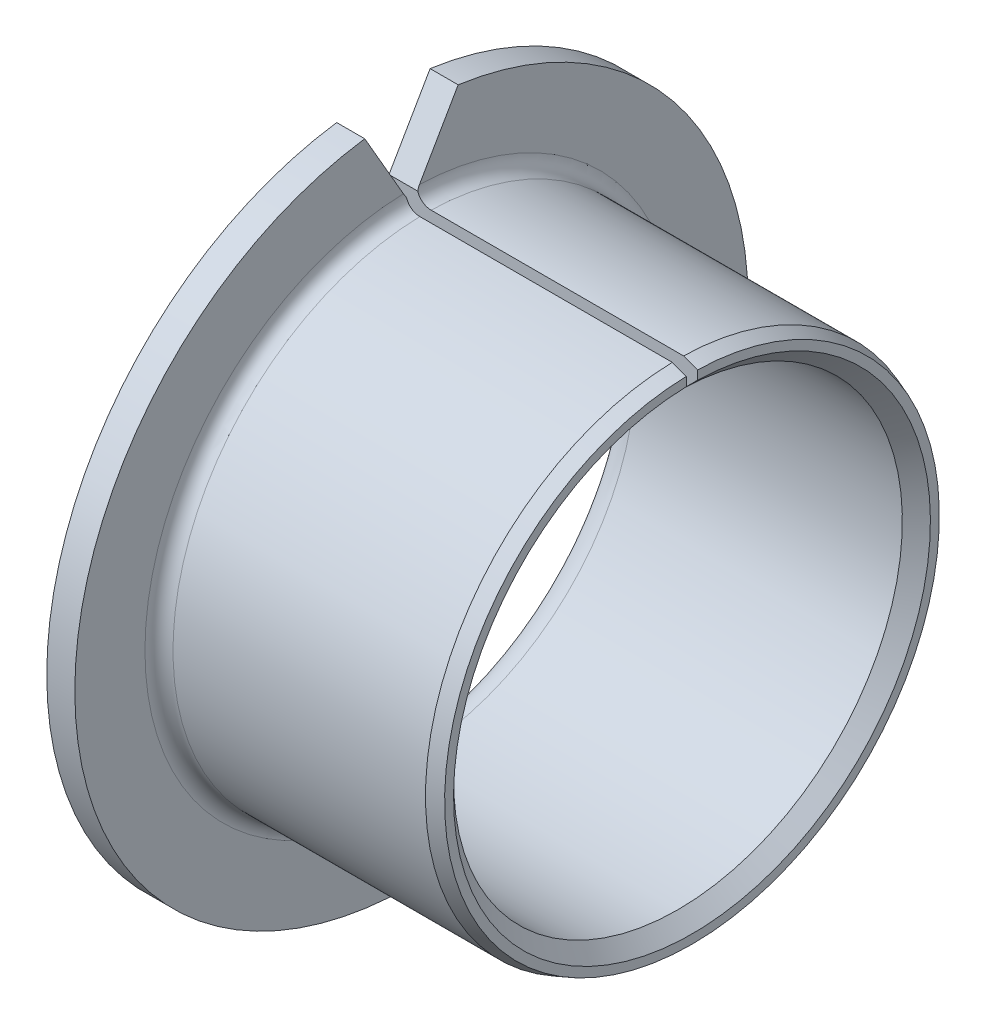
ISO-10303-21;
HEADER;
FILE_DESCRIPTION(('STEP AP214'),'2;1');
FILE_NAME('part.step','',(''),(''),'','','');
FILE_SCHEMA(('AUTOMOTIVE_DESIGN { 1 0 10303 214 1 1 1 1 }'));
ENDSEC;
DATA;
#1=APPLICATION_CONTEXT('core data for automotive mechanical design processes');
#2=APPLICATION_PROTOCOL_DEFINITION('international standard','automotive_design',2000,#1);
#3=PRODUCT_CONTEXT('',#1,'mechanical');
#4=PRODUCT('Part','Part','',(#3));
#5=PRODUCT_RELATED_PRODUCT_CATEGORY('part','',(#4));
#6=PRODUCT_DEFINITION_FORMATION('','',#4);
#7=PRODUCT_DEFINITION_CONTEXT('part definition',#1,'design');
#8=PRODUCT_DEFINITION('design','',#6,#7);
#9=PRODUCT_DEFINITION_SHAPE('','',#8);
#10=(LENGTH_UNIT() NAMED_UNIT(*) SI_UNIT(.MILLI.,.METRE.));
#11=(NAMED_UNIT(*) PLANE_ANGLE_UNIT() SI_UNIT($,.RADIAN.));
#12=(NAMED_UNIT(*) SI_UNIT($,.STERADIAN.) SOLID_ANGLE_UNIT());
#13=UNCERTAINTY_MEASURE_WITH_UNIT(LENGTH_MEASURE(1.E-05),#10,'distance_accuracy_value','');
#14=(GEOMETRIC_REPRESENTATION_CONTEXT(3) GLOBAL_UNCERTAINTY_ASSIGNED_CONTEXT((#13)) GLOBAL_UNIT_ASSIGNED_CONTEXT((#10,
#11,#12)) REPRESENTATION_CONTEXT('',''));
#15=CARTESIAN_POINT('',(0.,0.,0.));
#16=DIRECTION('',(0.,0.,1.));
#17=DIRECTION('',(1.,0.,0.));
#18=AXIS2_PLACEMENT_3D('',#15,#16,#17);
#19=CARTESIAN_POINT('',(0.,12.,0.));
#20=DIRECTION('',(-1.,0.,0.));
#21=DIRECTION('',(0.,0.,1.));
#22=AXIS2_PLACEMENT_3D('',#19,#20,#21);
#23=PLANE('',#22);
#24=DIRECTION('',(0.,0.866025403784439,-0.5));
#25=VECTOR('',#24,1.);
#26=CARTESIAN_POINT('',(0.,12.3495049383621,-1.93383757781533));
#27=LINE('',#26,#25);
#28=CARTESIAN_POINT('',(0.,9.34641016151379,-0.2));
#29=VERTEX_POINT('',#28);
#30=CARTESIAN_POINT('',(0.,11.8839244339988,-1.66503454829176));
#31=VERTEX_POINT('',#30);
#32=EDGE_CURVE('E101',#29,#31,#27,.T.);
#33=ORIENTED_EDGE('',*,*,#32,.T.);
#34=CARTESIAN_POINT('',(0.,0.,0.));
#35=DIRECTION('',(-1.,0.,0.));
#36=DIRECTION('',(0.,0.,1.));
#37=AXIS2_PLACEMENT_3D('',#34,#35,#36);
#38=CIRCLE('',#37,12.);
#39=CARTESIAN_POINT('',(0.,11.8839244339988,1.66503454829178));
#40=VERTEX_POINT('',#39);
#41=EDGE_CURVE('E196',#40,#31,#38,.F.);
#42=ORIENTED_EDGE('',*,*,#41,.F.);
#43=DIRECTION('',(0.,-0.866025403784439,-0.5));
#44=VECTOR('',#43,1.);
#45=CARTESIAN_POINT('',(0.,9.34641016151378,0.2));
#46=LINE('',#45,#44);
#47=CARTESIAN_POINT('',(0.,9.34641016151378,0.2));
#48=VERTEX_POINT('',#47);
#49=EDGE_CURVE('E121',#40,#48,#46,.T.);
#50=ORIENTED_EDGE('',*,*,#49,.T.);
#51=DIRECTION('',(0.,1.,0.));
#52=VECTOR('',#51,1.);
#53=CARTESIAN_POINT('',(0.,12.,0.2));
#54=LINE('',#53,#52);
#55=CARTESIAN_POINT('',(3.93835701897882E-10,8.9978219069115,0.199999999745788));
#56=VERTEX_POINT('',#55);
#57=EDGE_CURVE('E122',#48,#56,#54,.F.);
#58=ORIENTED_EDGE('',*,*,#57,.T.);
#59=CARTESIAN_POINT('',(9.83320196101811E-10,0.,0.));
#60=DIRECTION('',(-1.,0.,0.));
#61=DIRECTION('',(0.,0.999753058362945,-0.0222221127244391));
#62=AXIS2_PLACEMENT_3D('',#59,#60,#61);
#63=CIRCLE('',#62,9.00004434682071);
#64=CARTESIAN_POINT('',(5.89992291133434E-10,8.99782186113614,-0.2));
#65=VERTEX_POINT('',#64);
#66=EDGE_CURVE('E126',#65,#56,#63,.T.);
#67=ORIENTED_EDGE('',*,*,#66,.F.);
#68=DIRECTION('',(0.,1.,0.));
#69=VECTOR('',#68,1.);
#70=CARTESIAN_POINT('',(0.,12.,-0.200000000000001));
#71=LINE('',#70,#69);
#72=EDGE_CURVE('E113',#65,#29,#71,.T.);
#73=ORIENTED_EDGE('',*,*,#72,.T.);
#74=EDGE_LOOP('',(#33,#42,#50,#58,#67,#73));
#75=FACE_BOUND('',#74,.T.);
#76=ADVANCED_FACE('F17',(#75),#23,.T.);
#77=CARTESIAN_POINT('',(11.,9.34641016151378,0.2));
#78=DIRECTION('',(0.,-0.5,0.866025403784439));
#79=DIRECTION('',(0.,-0.866025403784439,-0.5));
#80=AXIS2_PLACEMENT_3D('',#77,#78,#79);
#81=PLANE('',#80);
#82=DIRECTION('',(0.,0.866025403784433,0.50000000000001));
#83=VECTOR('',#82,1.);
#84=CARTESIAN_POINT('',(1.,9.49568837309472,0.286185815640402));
#85=LINE('',#84,#83);
#86=CARTESIAN_POINT('',(1.,9.49568837309472,0.286185815640402));
#87=VERTEX_POINT('',#86);
#88=CARTESIAN_POINT('',(1.,11.8839244339988,1.6650345482918));
#89=VERTEX_POINT('',#88);
#90=EDGE_CURVE('E380',#87,#89,#85,.T.);
#91=ORIENTED_EDGE('',*,*,#90,.F.);
#92=CARTESIAN_POINT('',(1.02348889883189,9.34641016151753,0.200000000002162));
#93=CARTESIAN_POINT('',(1.01567070419771,9.37082921657609,0.214098348013579));
#94=CARTESIAN_POINT('',(1.00980419864463,9.39547859507013,0.228329673322472));
#95=CARTESIAN_POINT('',(1.00197456570067,9.44523799892917,0.257058278535206));
#96=CARTESIAN_POINT('',(1.00001143830979,9.47034802429418,0.271555558439047));
#97=CARTESIAN_POINT('',(1.,9.49568837309466,0.286185815640364));
#98=B_SPLINE_CURVE_WITH_KNOTS('',3,(#92,#93,#94,#95,#96,#97),.UNSPECIFIED.,.F.,.F.,(4,2,4),(0.,
0.0871828269118924,0.174365653823783),.UNSPECIFIED.);
#99=CARTESIAN_POINT('',(1.02348889883183,9.34641016151771,0.200000000001133));
#100=VERTEX_POINT('',#99);
#101=EDGE_CURVE('E197',#100,#87,#98,.T.);
#102=ORIENTED_EDGE('',*,*,#101,.F.);
#103=DIRECTION('',(1.,0.,0.));
#104=VECTOR('',#103,1.);
#105=CARTESIAN_POINT('',(11.,9.34641016151378,0.2));
#106=LINE('',#105,#104);
#107=EDGE_CURVE('E198',#48,#100,#106,.T.);
#108=ORIENTED_EDGE('',*,*,#107,.F.);
#109=ORIENTED_EDGE('',*,*,#49,.F.);
#110=DIRECTION('',(-1.,0.,0.));
#111=VECTOR('',#110,1.);
#112=CARTESIAN_POINT('',(11.,11.8839244339988,1.66503454829179));
#113=LINE('',#112,#111);
#114=EDGE_CURVE('E192',#89,#40,#113,.T.);
#115=ORIENTED_EDGE('',*,*,#114,.F.);
#116=EDGE_LOOP('',(#91,#102,#108,#109,#115));
#117=FACE_BOUND('',#116,.T.);
#118=ADVANCED_FACE('F411',(#117),#81,.F.);
#119=CARTESIAN_POINT('',(11.,0.,0.));
#120=DIRECTION('',(-1.,0.,0.));
#121=DIRECTION('',(0.,0.,1.));
#122=AXIS2_PLACEMENT_3D('',#119,#120,#121);
#123=CYLINDRICAL_SURFACE('',#122,12.);
#124=DIRECTION('',(1.,0.,0.));
#125=VECTOR('',#124,1.);
#126=CARTESIAN_POINT('',(11.,11.8839244339988,-1.66503454829175));
#127=LINE('',#126,#125);
#128=CARTESIAN_POINT('',(1.,11.8839244339988,-1.66503454829177));
#129=VERTEX_POINT('',#128);
#130=EDGE_CURVE('E147',#31,#129,#127,.T.);
#131=ORIENTED_EDGE('',*,*,#130,.T.);
#132=CARTESIAN_POINT('',(1.,0.,0.));
#133=DIRECTION('',(-1.,0.,0.));
#134=DIRECTION('',(0.,0.,1.));
#135=AXIS2_PLACEMENT_3D('',#132,#133,#134);
#136=CIRCLE('',#135,12.);
#137=EDGE_CURVE('E377',#89,#129,#136,.F.);
#138=ORIENTED_EDGE('',*,*,#137,.F.);
#139=ORIENTED_EDGE('',*,*,#114,.T.);
#140=ORIENTED_EDGE('',*,*,#41,.T.);
#141=EDGE_LOOP('',(#131,#138,#139,#140));
#142=FACE_BOUND('',#141,.T.);
#143=ADVANCED_FACE('F413',(#142),#123,.T.);
#144=CARTESIAN_POINT('',(11.,12.3495049383621,-1.93383757781533));
#145=DIRECTION('',(0.,-0.5,-0.866025403784439));
#146=DIRECTION('',(0.,0.866025403784439,-0.5));
#147=AXIS2_PLACEMENT_3D('',#144,#145,#146);
#148=PLANE('',#147);
#149=ORIENTED_EDGE('',*,*,#32,.F.);
#150=DIRECTION('',(1.,0.,0.));
#151=VECTOR('',#150,1.);
#152=CARTESIAN_POINT('',(11.,9.34641016151379,-0.199999999999999));
#153=LINE('',#152,#151);
#154=CARTESIAN_POINT('',(1.02348889883235,9.34641016151609,-0.200000000000581));
#155=VERTEX_POINT('',#154);
#156=EDGE_CURVE('E109',#155,#29,#153,.F.);
#157=ORIENTED_EDGE('',*,*,#156,.F.);
#158=CARTESIAN_POINT('',(1.,9.49568837309472,-0.286185815640397));
#159=CARTESIAN_POINT('',(1.00001143830979,9.47034802429397,-0.271555558438963));
#160=CARTESIAN_POINT('',(1.00197456570071,9.44523799892873,-0.257058278534979));
#161=CARTESIAN_POINT('',(1.00980419864481,9.39547859506924,-0.228329673321914));
#162=CARTESIAN_POINT('',(1.01567070419799,9.370829216575,-0.214098348012832));
#163=CARTESIAN_POINT('',(1.02348889883229,9.34641016151626,-0.200000000001201));
#164=B_SPLINE_CURVE_WITH_KNOTS('',3,(#158,#159,#160,#161,#162,#163),.UNSPECIFIED.,.F.,.F.,(4,2,
4),(0.,0.0871828269127378,0.174365653825477),.UNSPECIFIED.);
#165=CARTESIAN_POINT('',(1.,9.49568837309472,-0.286185815640397));
#166=VERTEX_POINT('',#165);
#167=EDGE_CURVE('E187',#166,#155,#164,.T.);
#168=ORIENTED_EDGE('',*,*,#167,.F.);
#169=DIRECTION('',(0.,-0.866025403784436,0.500000000000005));
#170=VECTOR('',#169,1.);
#171=CARTESIAN_POINT('',(1.,11.8839244339988,-1.66503454829176));
#172=LINE('',#171,#170);
#173=EDGE_CURVE('E350',#129,#166,#172,.T.);
#174=ORIENTED_EDGE('',*,*,#173,.F.);
#175=ORIENTED_EDGE('',*,*,#130,.F.);
#176=EDGE_LOOP('',(#149,#157,#168,#174,#175));
#177=FACE_BOUND('',#176,.T.);
#178=ADVANCED_FACE('F172',(#177),#148,.F.);
#179=CARTESIAN_POINT('',(1.,0.,0.));
#180=DIRECTION('',(1.,0.,0.));
#181=DIRECTION('',(0.,0.,-1.));
#182=AXIS2_PLACEMENT_3D('',#179,#180,#181);
#183=TOROIDAL_SURFACE('',#182,9.,1.);
#184=CARTESIAN_POINT('',(1.,7.99749960925288,-0.199999999999999));
#185=CARTESIAN_POINT('',(0.971871414945486,7.997499804327,-0.2));
#186=CARTESIAN_POINT('',(0.943756318828743,7.99868755750618,-0.2));
#187=CARTESIAN_POINT('',(0.887727334196172,8.00342596883858,-0.2));
#188=CARTESIAN_POINT('',(0.859813436194008,8.00697651484146,-0.2));
#189=CARTESIAN_POINT('',(0.776722868588706,8.02113851219534,-0.199999999999999));
#190=CARTESIAN_POINT('',(0.722102828564132,8.03526041715735,-0.199999999999997));
#191=CARTESIAN_POINT('',(0.6160107924097,8.07247242885563,-0.199999999999998));
#192=CARTESIAN_POINT('',(0.564540310742494,8.09556681138086,-0.2));
#193=CARTESIAN_POINT('',(0.466206812927779,8.15006709133321,-0.2));
#194=CARTESIAN_POINT('',(0.419343000111004,8.18147154815014,-0.199999999999997));
#195=CARTESIAN_POINT('',(0.331545038697365,8.25170088503872,-0.199999999999998));
#196=CARTESIAN_POINT('',(0.290612336837096,8.29052757022676,-0.2));
#197=CARTESIAN_POINT('',(0.215831708292732,8.37452581862572,-0.2));
#198=CARTESIAN_POINT('',(0.181983684381516,8.41969729474919,-0.199999999999997));
#199=CARTESIAN_POINT('',(0.137263136410866,8.49120666475099,-0.199999999999998));
#200=CARTESIAN_POINT('',(0.123354442160423,8.51569377159722,-0.199999999999999));
#201=CARTESIAN_POINT('',(0.0976587184198239,8.56572745954603,-0.200000000000001));
#202=CARTESIAN_POINT('',(0.0858698120671186,8.59127307853176,-0.2));
#203=CARTESIAN_POINT('',(0.0538067712522925,8.6692614442704,-0.2));
#204=CARTESIAN_POINT('',(0.036805360412886,8.72310529343862,-0.200000000000001));
#205=CARTESIAN_POINT('',(0.0163207662225758,8.81402564518383,-0.200000000000001));
#206=CARTESIAN_POINT('',(0.0102030553938365,8.85054041471544,-0.200000000000001));
#207=CARTESIAN_POINT('',(0.0020435035294085,8.92397005148684,-0.199999999999999));
#208=CARTESIAN_POINT('',(-4.10934887400373E-06,8.96088427740099,-0.199999999999997));
#209=CARTESIAN_POINT('',(9.83320196101811E-10,8.99782186113611,-0.199999999999994));
#210=B_SPLINE_CURVE_WITH_KNOTS('',3,(#184,#185,#186,#187,#188,#189,#190,#191,#192,#193,#194,
#195,#196,#197,#198,#199,#200,#201,#202,#203,#204,#205,#206,#207,#208,#209),.UNSPECIFIED.,.F.,
.F.,(4,2,2,2,2,2,2,2,2,2,2,2,4),(0.,0.0843338934099975,0.16866378418455,0.337043683742215,
0.505503922509155,0.673934976612194,0.842407046073428,1.01087680334367,1.09527372181419,
1.17959554320749,1.34806596549814,1.45893316407308,1.56964302838705),.UNSPECIFIED.);
#211=CARTESIAN_POINT('',(1.,7.997499607692,-0.200000062415672));
#212=VERTEX_POINT('',#211);
#213=EDGE_CURVE('E118',#212,#65,#210,.T.);
#214=ORIENTED_EDGE('',*,*,#213,.T.);
#215=ORIENTED_EDGE('',*,*,#66,.T.);
#216=CARTESIAN_POINT('',(9.85350906770877E-10,8.99782190691147,0.199999999999998));
#217=CARTESIAN_POINT('',(-1.04430401788738E-06,8.96967407775827,0.199999999999999));
#218=CARTESIAN_POINT('',(0.00118611741154283,8.94153969249176,0.2));
#219=CARTESIAN_POINT('',(0.00592468819557625,8.88547208709523,0.2));
#220=CARTESIAN_POINT('',(0.00947598726349091,8.85753885766677,0.2));
#221=CARTESIAN_POINT('',(0.0236424651670153,8.77438958809962,0.199999999999999));
#222=CARTESIAN_POINT('',(0.0377703136157513,8.71973028517275,0.199999999999997));
#223=CARTESIAN_POINT('',(0.0750011049565448,8.61356106793746,0.199999999999998));
#224=CARTESIAN_POINT('',(0.098108368339818,8.56205268353904,0.2));
#225=CARTESIAN_POINT('',(0.152642502379736,8.46364747132945,0.2));
#226=CARTESIAN_POINT('',(0.184067895811041,8.41674982671832,0.199999999999998));
#227=CARTESIAN_POINT('',(0.254339867368208,8.32890169385607,0.199999999999997));
#228=CARTESIAN_POINT('',(0.293186523604231,8.28795126820851,0.199999999999999));
#229=CARTESIAN_POINT('',(0.377230678531014,8.21314318802559,0.200000000000001));
#230=CARTESIAN_POINT('',(0.422428059819834,8.17928540240176,0.200000000000002));
#231=CARTESIAN_POINT('',(0.493967065976243,8.1345670010867,0.200000000000001));
#232=CARTESIAN_POINT('',(0.518455451135814,8.120664739008,0.2));
#233=CARTESIAN_POINT('',(0.568491573207099,8.09498286256818,0.2));
#234=CARTESIAN_POINT('',(0.594038348650009,8.08320137149205,0.2));
#235=CARTESIAN_POINT('',(0.67202956910246,8.05116265808885,0.2));
#236=CARTESIAN_POINT('',(0.725874938391036,8.03417998165877,0.199999999999997));
#237=CARTESIAN_POINT('',(0.816693282885207,8.01375476427109,0.199999999999998));
#238=CARTESIAN_POINT('',(0.853102899597982,8.00766448305938,0.199999999999999));
#239=CARTESIAN_POINT('',(0.926319470481443,7.99953938419615,0.200000000000001));
#240=CARTESIAN_POINT('',(0.96312578677381,7.99749881810905,0.200000000000003));
#241=CARTESIAN_POINT('',(0.999955629849104,7.99749961023755,0.200000000000005));
#242=B_SPLINE_CURVE_WITH_KNOTS('',3,(#216,#217,#218,#219,#220,#221,#222,#223,#224,#225,#226,
#227,#228,#229,#230,#231,#232,#233,#234,#235,#236,#237,#238,#239,#240,#241),.UNSPECIFIED.,.F.,
.F.,(4,2,2,2,2,2,2,2,2,2,2,2,4),(0.,0.0843915990611702,0.168779271753928,0.337277149117021,
0.505856200676655,0.674405334170712,0.842956241773244,1.01150403388885,1.09589469741551,
1.18021031075331,1.34866681459613,1.4592109073199,1.56959797383833),.UNSPECIFIED.);
#243=CARTESIAN_POINT('',(0.999955629849096,7.99749960974521,0.199999999999999));
#244=VERTEX_POINT('',#243);
#245=EDGE_CURVE('E141',#56,#244,#242,.T.);
#246=ORIENTED_EDGE('',*,*,#245,.T.);
#247=CARTESIAN_POINT('',(0.999955629849074,7.99749960925288,0.199999999999998));
#248=CARTESIAN_POINT('',(0.999955745396342,7.99425584669437,0.329817525635112));
#249=CARTESIAN_POINT('',(0.99995586094361,7.9878459693048,0.459555646562764));
#250=CARTESIAN_POINT('',(0.999956092038146,7.96872097204646,0.718566353136858));
#251=CARTESIAN_POINT('',(0.999956207585414,7.95600585217768,0.847838938783299));
#252=CARTESIAN_POINT('',(0.99995643867995,7.92429735714384,1.10561184892869));
#253=CARTESIAN_POINT('',(0.999956554227217,7.90530398197876,1.23411217342763));
#254=CARTESIAN_POINT('',(0.999956785321754,7.86108485426495,1.490035962113));
#255=CARTESIAN_POINT('',(0.999956900869023,7.83585910171621,1.61745942629943));
#256=CARTESIAN_POINT('',(0.99995713196356,7.77923480020517,1.87092736908002));
#257=CARTESIAN_POINT('',(0.999957247510827,7.74783625124287,1.9969718476742));
#258=CARTESIAN_POINT('',(0.999957478605363,7.67894086055886,2.24738298466373));
#259=CARTESIAN_POINT('',(0.999957594152631,7.64144401883715,2.37174964305909));
#260=CARTESIAN_POINT('',(0.999957825247167,7.56044092768306,2.61851027730199));
#261=CARTESIAN_POINT('',(0.999957940794435,7.51693467825067,2.74090425314953));
#262=CARTESIAN_POINT('',(0.999958171888971,7.42401592508808,2.98342933850911));
#263=CARTESIAN_POINT('',(0.999958287436238,7.37460342135787,3.10356044802114));
#264=CARTESIAN_POINT('',(0.999958518530774,7.26998931062943,3.34127498154762));
#265=CARTESIAN_POINT('',(0.999958634078042,7.21478770363119,3.45885840556206));
#266=CARTESIAN_POINT('',(0.999958865172578,7.09872626427488,3.69119878935309));
#267=CARTESIAN_POINT('',(0.999958980719846,7.03786643191679,3.80595574912968));
#268=CARTESIAN_POINT('',(0.999959211814382,6.910632834449,4.03237112694488));
#269=CARTESIAN_POINT('',(0.999959327361651,6.84425906933929,4.14402954498349));
#270=CARTESIAN_POINT('',(0.999959558456188,6.70615497207652,4.36398310816891));
#271=CARTESIAN_POINT('',(0.999959674003457,6.63442463992346,4.47227825331573));
#272=CARTESIAN_POINT('',(0.999959905097993,6.48577747414875,4.68524851355178));
#273=CARTESIAN_POINT('',(0.999960020645261,6.4088606405271,4.78992362864101));
#274=CARTESIAN_POINT('',(0.999960251739797,6.25002283408376,4.99540565433277));
#275=CARTESIAN_POINT('',(0.999960367287065,6.16810186126208,5.0962125649353));
#276=CARTESIAN_POINT('',(0.999960598381601,5.99945000300837,5.29371917835776));
#277=CARTESIAN_POINT('',(0.999960713928869,5.91271911757632,5.3904188811777));
#278=CARTESIAN_POINT('',(0.999960945023404,5.73465306452304,5.57948181352587));
#279=CARTESIAN_POINT('',(0.999961060570672,5.64331789690179,5.67184504305411));
#280=CARTESIAN_POINT('',(0.999961291665208,5.45625982619249,5.85201604466251));
#281=CARTESIAN_POINT('',(0.999961407212476,5.36053692310444,5.93982381674267));
#282=CARTESIAN_POINT('',(0.999961638307012,5.16493033107432,6.1106757198413));
#283=CARTESIAN_POINT('',(0.99996175385428,5.06504664213225,6.19371985085976));
#284=CARTESIAN_POINT('',(0.999961984948816,4.86135529282197,6.35484758234698));
#285=CARTESIAN_POINT('',(0.999962100496085,4.75754763245376,6.43293118281574));
#286=CARTESIAN_POINT('',(0.999962331590622,4.54625445807037,6.58395272464686));
#287=CARTESIAN_POINT('',(0.999962447137889,4.43876894405518,6.65689066600922));
#288=CARTESIAN_POINT('',(0.999962678232425,4.22037489998723,6.79744796092381));
#289=CARTESIAN_POINT('',(0.999962793779693,4.10946636993446,6.86506731447604));
#290=CARTESIAN_POINT('',(0.999963024874229,3.88448924703593,6.99482711491655));
#291=CARTESIAN_POINT('',(0.999963140421497,3.77042065419018,7.05696756180483));
#292=CARTESIAN_POINT('',(0.999963371516033,3.53939385114916,7.17562222001389));
#293=CARTESIAN_POINT('',(0.999963487063301,3.4224356409539,7.23213643133466));
#294=CARTESIAN_POINT('',(0.999963718157837,3.18590689965662,7.33940462875769));
#295=CARTESIAN_POINT('',(0.999963833705104,3.06633636855461,7.39015861485996));
#296=CARTESIAN_POINT('',(0.99996406479964,2.82486647544317,7.48578602912392));
#297=CARTESIAN_POINT('',(0.999964180346908,2.70296711343374,7.53065945728561));
#298=CARTESIAN_POINT('',(0.999964411441444,2.45712856993646,7.61441936517234));
#299=CARTESIAN_POINT('',(0.999964526988712,2.3331893884486,7.65330584489738));
#300=CARTESIAN_POINT('',(0.999964758083248,2.08356505363528,7.72499965988215));
#301=CARTESIAN_POINT('',(0.999964873630517,1.95787990030983,7.75780699514188));
#302=CARTESIAN_POINT('',(0.999965104725054,1.70506160899012,7.81726473822254));
#303=CARTESIAN_POINT('',(0.999965220272321,1.57792847099587,7.84391514604347));
#304=CARTESIAN_POINT('',(0.999965451366857,1.32251563053697,7.89099584874399));
#305=CARTESIAN_POINT('',(0.999965566914125,1.19423592807232,7.91142614362359));
#306=CARTESIAN_POINT('',(0.999965798008661,0.936834097262884,7.9460181822165));
#307=CARTESIAN_POINT('',(0.999965913555929,0.807711968918105,7.96017992592981));
#308=CARTESIAN_POINT('',(0.999966144650465,0.54893142224782,7.98220128608509));
#309=CARTESIAN_POINT('',(0.999966260197735,0.419273003922313,7.99006090252706));
#310=CARTESIAN_POINT('',(0.99996649129227,0.1597272846809,7.99945937376008));
#311=CARTESIAN_POINT('',(0.999966606839537,0.0298399837649935,8.00099822855113));
#312=CARTESIAN_POINT('',(0.999966837934072,-0.229855550608719,7.9977515280086));
#313=CARTESIAN_POINT('',(0.999966953481342,-0.359663784066524,7.992965972675));
#314=CARTESIAN_POINT('',(0.999967184575879,-0.618893420936723,7.97708179796539));
#315=CARTESIAN_POINT('',(0.999967300123146,-0.748314824349115,7.96598317858938));
#316=CARTESIAN_POINT('',(0.999967531217682,-1.00646395567727,7.93749918953268));
#317=CARTESIAN_POINT('',(0.999967646764949,-1.13519168359302,7.92011381985201));
#318=CARTESIAN_POINT('',(0.999967877859486,-1.39164826311323,7.879097549192));
#319=CARTESIAN_POINT('',(0.999967993406755,-1.51937711471769,7.85546664821267));
#320=CARTESIAN_POINT('',(0.999968224501292,-1.77353310903836,7.80201534150339));
#321=CARTESIAN_POINT('',(0.999968340048559,-1.89996025175458,7.77219493577343));
#322=CARTESIAN_POINT('',(0.999968571143095,-2.15121308194594,7.70643532081949));
#323=CARTESIAN_POINT('',(0.999968686690363,-2.27603876942108,7.6704961115955));
#324=CARTESIAN_POINT('',(0.999968917784899,-2.52379273967071,7.59258409799292));
#325=CARTESIAN_POINT('',(0.999969033332167,-2.64672102244519,7.55061129361432));
#326=CARTESIAN_POINT('',(0.999969264426702,-2.89038873239434,7.46073160310417));
#327=CARTESIAN_POINT('',(0.99996937997397,-3.011128159569,7.41282471697262));
#328=CARTESIAN_POINT('',(0.999969611068507,-3.25013189698123,7.31119044548388));
#329=CARTESIAN_POINT('',(0.999969726615776,-3.3683962072188,7.2574630601267));
#330=CARTESIAN_POINT('',(0.999969957710312,-3.60216931767903,7.14431517254673));
#331=CARTESIAN_POINT('',(0.999970073257578,-3.71767811790169,7.08489467032394));
#332=CARTESIAN_POINT('',(0.999970304352114,-3.94566634829821,6.96050142919435));
#333=CARTESIAN_POINT('',(0.999970419899383,-4.05814577847207,6.89552869028756));
#334=CARTESIAN_POINT('',(0.99997065099392,-4.27980859107631,6.76018501978007));
#335=CARTESIAN_POINT('',(0.999970766541188,-4.38899197350669,6.68981408817939));
#336=CARTESIAN_POINT('',(0.999970997635723,-4.60380382753513,6.54384087485953));
#337=CARTESIAN_POINT('',(0.999971113182991,-4.7094322991332,6.46823859314037));
#338=CARTESIAN_POINT('',(0.999971344277527,-4.91688389675303,6.31198192517693));
#339=CARTESIAN_POINT('',(0.999971459824795,-5.01870702277481,6.23132753893265));
#340=CARTESIAN_POINT('',(0.999971690919331,-5.21830651659913,6.06515788555654));
#341=CARTESIAN_POINT('',(0.999971806466598,-5.31608288440167,5.97964261842471));
#342=CARTESIAN_POINT('',(0.999972037561135,-5.50735704361137,5.80395395158281));
#343=CARTESIAN_POINT('',(0.999972153108404,-5.60085483501852,5.71378055187274));
#344=CARTESIAN_POINT('',(0.999972384202941,-5.78335016734615,5.52898941215904));
#345=CARTESIAN_POINT('',(0.999972499750208,-5.87234770826663,5.43437167215541));
#346=CARTESIAN_POINT('',(0.999972730844744,-6.04563153518207,5.24091618123411));
#347=CARTESIAN_POINT('',(0.999972846392012,-6.12991782117704,5.14207843031645));
#348=CARTESIAN_POINT('',(0.999973077486548,-6.29357930372586,4.94041725217851));
#349=CARTESIAN_POINT('',(0.999973193033818,-6.37295450027972,4.83759382495823));
#350=CARTESIAN_POINT('',(0.999973424128353,-6.52660561314202,4.628205078474));
#351=CARTESIAN_POINT('',(0.99997353967562,-6.60088152945047,4.52163975921005));
#352=CARTESIAN_POINT('',(0.999973770770155,-6.74415798091087,4.30501988455637));
#353=CARTESIAN_POINT('',(0.999973886317425,-6.81315851606282,4.19496532916664));
#354=CARTESIAN_POINT('',(0.999974117411961,-6.94572061171035,3.97162791081585));
#355=CARTESIAN_POINT('',(0.999974232959227,-7.00928217220593,3.85834504785479));
#356=CARTESIAN_POINT('',(0.999974464053763,-7.13081562031619,3.62881959691636));
#357=CARTESIAN_POINT('',(0.999974579601032,-7.18878750793086,3.51257700893898));
#358=CARTESIAN_POINT('',(0.999974810695569,-7.29900416462083,3.27740770774058));
#359=CARTESIAN_POINT('',(0.999974926242837,-7.35124893369612,3.15848099451955));
#360=CARTESIAN_POINT('',(0.999975157337373,-7.44988748608506,2.91822540640415));
#361=CARTESIAN_POINT('',(0.99997527288464,-7.49628126939872,2.79689653150979));
#362=CARTESIAN_POINT('',(0.999975503979176,-7.58310785515539,2.5521242789077));
#363=CARTESIAN_POINT('',(0.999975619526444,-7.62354065759841,2.42868090119998));
#364=CARTESIAN_POINT('',(0.99997585062098,-7.69834941940569,2.17997231510991));
#365=CARTESIAN_POINT('',(0.999975966168249,-7.73272537876995,2.05470710672755));
#366=CARTESIAN_POINT('',(0.999976197262786,-7.79533895239234,1.80265185080875));
#367=CARTESIAN_POINT('',(0.999976312810054,-7.82357656665048,1.6758618032723));
#368=CARTESIAN_POINT('',(0.999976543904589,-7.87384650144733,1.42105747580987));
#369=CARTESIAN_POINT('',(0.999976659451857,-7.89587882198605,1.2930431958839));
#370=CARTESIAN_POINT('',(0.999976890546393,-7.93368593287346,1.0360939129419));
#371=CARTESIAN_POINT('',(0.999977006093661,-7.94946072322215,0.907158909925874));
#372=CARTESIAN_POINT('',(0.999977237188197,-7.97471537324908,0.648673873047378));
#373=CARTESIAN_POINT('',(0.999977352735467,-7.98419523292733,0.519123839184904));
#374=CARTESIAN_POINT('',(0.999977583830003,-7.99683754579605,0.25971589103491));
#375=CARTESIAN_POINT('',(0.999977699377269,-7.99999999898654,0.12985797674739));
#376=CARTESIAN_POINT('',(0.999977930471805,-8.00000000101346,-0.129857851877014));
#377=CARTESIAN_POINT('',(0.999978046019074,-7.99683754984991,-0.259715766213898));
#378=CARTESIAN_POINT('',(0.999978277113611,-7.98419524103022,-0.519123714561223));
#379=CARTESIAN_POINT('',(0.999978392660878,-7.9747153833741,-0.648673748571665));
#380=CARTESIAN_POINT('',(0.999978623755414,-7.94946073738181,-0.907158785844356));
#381=CARTESIAN_POINT('',(0.999978739302682,-7.93368594904564,-1.03609378910661));
#382=CARTESIAN_POINT('',(0.999978970397218,-7.8958788421689,-1.29304307263873));
#383=CARTESIAN_POINT('',(0.999979085944486,-7.87384652362833,-1.4210573529086));
#384=CARTESIAN_POINT('',(0.999979317039022,-7.82357659280866,-1.67586168115568));
#385=CARTESIAN_POINT('',(0.999979432586289,-7.79533898052957,-1.80265172913289));
#386=CARTESIAN_POINT('',(0.999979663680826,-7.73272541084145,-2.05470698602902));
#387=CARTESIAN_POINT('',(0.999979779228095,-7.69834945343243,-2.17997219494793));
#388=CARTESIAN_POINT('',(0.999980010322631,-7.6235406955072,-2.42868078220568));
#389=CARTESIAN_POINT('',(0.999980125869899,-7.58310789499098,-2.55212416054451));
#390=CARTESIAN_POINT('',(0.999980356964435,-7.49628131305491,-2.79689641450186));
#391=CARTESIAN_POINT('',(0.999980472511703,-7.44988753163505,-2.91822529012037));
#392=CARTESIAN_POINT('',(0.999980703606238,-7.35124898299621,-3.1584808797754));
#393=CARTESIAN_POINT('',(0.999980819153507,-7.29900421577722,-3.2774075938119));
#394=CARTESIAN_POINT('',(0.999981050248042,-7.18878756275796,-3.51257689673066));
#395=CARTESIAN_POINT('',(0.99998116579531,-7.13081567695769,-3.62881948561291));
#396=CARTESIAN_POINT('',(0.999981396889847,-7.00928223243006,-3.85834493844833));
#397=CARTESIAN_POINT('',(0.999981512437116,-6.94572067370268,-3.97162780240151));
#398=CARTESIAN_POINT('',(0.999981743531652,-6.81315858154118,-4.19496522282143));
#399=CARTESIAN_POINT('',(0.999981859078918,-6.74415804810705,-4.30501977928818));
#400=CARTESIAN_POINT('',(0.999982090173454,-6.60088160002782,-4.52163965617824));
#401=CARTESIAN_POINT('',(0.999982205720723,-6.52660568538273,-4.62820497660154));
#402=CARTESIAN_POINT('',(0.99998243681526,-6.37295457578874,-4.83759372548408));
#403=CARTESIAN_POINT('',(0.999982552362527,-6.29357938083983,-4.94041715394331));
#404=CARTESIAN_POINT('',(0.999982783457063,-6.1299179014387,-5.14207833463581));
#405=CARTESIAN_POINT('',(0.999982899004331,-6.04563161698647,-5.24091608686908));
#406=CARTESIAN_POINT('',(0.999983130098867,-5.87234779309063,-5.43437158049513));
#407=CARTESIAN_POINT('',(0.999983245646136,-5.78335025364702,-5.5289893218879));
#408=CARTESIAN_POINT('',(0.999983476740673,-5.60085492420376,-5.71378046445014));
#409=CARTESIAN_POINT('',(0.99998359228794,-5.50735713420411,-5.80395386561959));
#410=CARTESIAN_POINT('',(0.999983823382476,-5.3160829777367,-5.97964253544705));
#411=CARTESIAN_POINT('',(0.999983938929744,-5.21830661126894,-6.06515780410505));
#412=CARTESIAN_POINT('',(0.99998417002428,-5.01870712003833,-6.23132746059667));
#413=CARTESIAN_POINT('',(0.999984285571548,-4.91688399527548,-6.31198184843028));
#414=CARTESIAN_POINT('',(0.999984516666084,-4.70943240009462,-6.4682385196318));
#415=CARTESIAN_POINT('',(0.999984632213352,-4.60380392967661,-6.54384080299969));
#416=CARTESIAN_POINT('',(0.999984863307888,-4.38899207792664,-6.6898140196725));
#417=CARTESIAN_POINT('',(0.999984978855156,-4.27980869659466,-6.76018495297741));
#418=CARTESIAN_POINT('',(0.999985209949691,-4.05814588610297,-6.89552862694478));
#419=CARTESIAN_POINT('',(0.999985325496959,-3.94566645694326,-6.96050136760725));
#420=CARTESIAN_POINT('',(0.999985556591496,-3.71767822848837,-7.08489461229545));
#421=CARTESIAN_POINT('',(0.999985672138764,-3.60216942919319,-7.1443151163212));
#422=CARTESIAN_POINT('',(0.999985903233301,-3.36839632049906,-7.25746300755008));
#423=CARTESIAN_POINT('',(0.999986018780569,-3.25013201110011,-7.31119039475323));
#424=CARTESIAN_POINT('',(0.999986249875105,-3.01112827527427,-7.41282466997253));
#425=CARTESIAN_POINT('',(0.999986365422373,-2.89038884884738,-7.46073155798868));
#426=CARTESIAN_POINT('',(0.999986596516908,-2.64672114030115,-7.55061125230219));
#427=CARTESIAN_POINT('',(0.999986712064176,-2.52379285818181,-7.59258405859955));
#428=CARTESIAN_POINT('',(0.999986943158712,-2.2760388891483,-7.67049607606927));
#429=CARTESIAN_POINT('',(0.99998705870598,-2.15121320223413,-7.70643528724164));
#430=CARTESIAN_POINT('',(0.999987289800516,-1.89996037306919,-7.77219490611734));
#431=CARTESIAN_POINT('',(0.999987405347785,-1.77353323081843,-7.80201531382067));
#432=CARTESIAN_POINT('',(0.999987636442322,-1.51937723733207,-7.85546662449703));
#433=CARTESIAN_POINT('',(0.999987751989589,-1.39164838609647,-7.87909752747005));
#434=CARTESIAN_POINT('',(0.999987983084125,-1.13519180721647,-7.92011380213303));
#435=CARTESIAN_POINT('',(0.999988098631393,-1.00646407957208,-7.93749917382299));
#436=CARTESIAN_POINT('',(0.999988329725929,-0.748314948688528,-7.96598316690908));
#437=CARTESIAN_POINT('',(0.999988445273197,-0.618893545449372,-7.97708178830521));
#438=CARTESIAN_POINT('',(0.999988676367733,-0.359663908827106,-7.99296596706108));
#439=CARTESIAN_POINT('',(0.999988791915,-0.229855675443996,-7.99775152442083));
#440=CARTESIAN_POINT('',(0.999989023009537,0.0298398588790389,-8.0009982290169));
#441=CARTESIAN_POINT('',(0.999989138556806,0.159727159818964,-7.99945937625323));
#442=CARTESIAN_POINT('',(0.999989369651342,0.419272879207077,-7.9900609090714));
#443=CARTESIAN_POINT('',(0.999989485198608,0.548931297655264,-7.98220129465325));
#444=CARTESIAN_POINT('',(0.999989716293144,0.807711844669277,-7.96017993853722));
#445=CARTESIAN_POINT('',(0.999989831840414,0.936833973235103,-7.94601819683935));
#446=CARTESIAN_POINT('',(0.99999006293495,1.19423580458447,-7.91142616226417));
#447=CARTESIAN_POINT('',(0.999990178482218,1.32251550736802,-7.89099586938687));
#448=CARTESIAN_POINT('',(0.999990409576753,1.5779283485618,-7.84391517067303));
#449=CARTESIAN_POINT('',(0.999990525124021,1.70506148697203,-7.8172647648365));
#450=CARTESIAN_POINT('',(0.999990756218558,1.95787977921979,-7.75780702570203));
#451=CARTESIAN_POINT('',(0.999990871765827,2.08356493305733,-7.72499969240409));
#452=CARTESIAN_POINT('',(0.999991102860363,2.3331892689897,-7.65330588131566));
#453=CARTESIAN_POINT('',(0.999991218407631,2.45712845108453,-7.61441940352516));
#454=CARTESIAN_POINT('',(0.999991449502167,2.70296699588921,-7.53065949947567));
#455=CARTESIAN_POINT('',(0.999991565049435,2.82486635859906,-7.48578607321668));
#456=CARTESIAN_POINT('',(0.999991796143971,3.06633625320312,-7.39015866272178));
#457=CARTESIAN_POINT('',(0.999991911691239,3.18590678509735,-7.33940467848586));
#458=CARTESIAN_POINT('',(0.999992142785774,3.42243552806895,-7.23213648475476));
#459=CARTESIAN_POINT('',(0.999992258333042,3.53939373914633,-7.17562227525957));
#460=CARTESIAN_POINT('',(0.999992489427578,3.7704205440394,-7.05696762065656));
#461=CARTESIAN_POINT('',(0.999992604974846,3.8844891378551,-6.99482717554875));
#462=CARTESIAN_POINT('',(0.999992836069382,4.10946626277902,-6.86506737861986));
#463=CARTESIAN_POINT('',(0.999992951616649,4.22037479388725,-6.79744802679878));
#464=CARTESIAN_POINT('',(0.999993182711186,4.43876884014913,-6.65689073529307));
#465=CARTESIAN_POINT('',(0.999993298258455,4.54625435530278,-6.58395279560842));
#466=CARTESIAN_POINT('',(0.999993529352992,4.75754753204344,-6.43293125707534));
#467=CARTESIAN_POINT('',(0.999993644900259,4.86135519363045,-6.35484765822689));
#468=CARTESIAN_POINT('',(0.999993875994795,5.06504654545574,-6.19371992991905));
#469=CARTESIAN_POINT('',(0.999993991542063,5.16493023569402,-6.11067580045965));
#470=CARTESIAN_POINT('',(0.999994222636599,5.36053683039093,-5.93982390041421));
#471=CARTESIAN_POINT('',(0.999994338183867,5.45625973484956,-5.85201612982816));
#472=CARTESIAN_POINT('',(0.999994569278403,5.64331780837111,-5.67184513113951));
#473=CARTESIAN_POINT('',(0.999994684825671,5.73465297743404,-5.57948190303691));
#474=CARTESIAN_POINT('',(0.999994915920207,5.91271903343837,-5.39041897346813));
#475=CARTESIAN_POINT('',(0.999995031467474,5.99944992037977,-5.29371927200196));
#476=CARTESIAN_POINT('',(0.99999526256201,6.16810178171634,-5.09621266121194));
#477=CARTESIAN_POINT('',(0.999995378109278,6.25002275611149,-4.9954057518881));
#478=CARTESIAN_POINT('',(0.999995609203814,6.40886056576215,-4.78992372867561));
#479=CARTESIAN_POINT('',(0.999995724751082,6.48577740101766,-4.68524861478696));
#480=CARTESIAN_POINT('',(0.999995955845618,6.63442457011658,-4.47227835687112));
#481=CARTESIAN_POINT('',(0.999996071392887,6.70615490395999,-4.36398321284392));
#482=CARTESIAN_POINT('',(0.999996302487424,6.84425900465597,-4.14402965181414));
#483=CARTESIAN_POINT('',(0.999996418034693,6.91063277150854,-4.03237123481155));
#484=CARTESIAN_POINT('',(0.999996649129229,7.0378663725104,-3.80595585898231));
#485=CARTESIAN_POINT('',(0.999996764676497,7.0987262066597,-3.69119890015566));
#486=CARTESIAN_POINT('',(0.999996995771033,7.21478764964258,-3.45885851817621));
#487=CARTESIAN_POINT('',(0.999997111318301,7.26998925847615,-3.3412750950234));
#488=CARTESIAN_POINT('',(0.999997342412837,7.37460337291503,-3.10356056312983));
#489=CARTESIAN_POINT('',(0.999997457960105,7.42401587852034,-2.98342945438906));
#490=CARTESIAN_POINT('',(0.99999768905464,7.51693463546845,-2.74090437047984));
#491=CARTESIAN_POINT('',(0.999997804601908,7.56044088681126,-2.61851039531138));
#492=CARTESIAN_POINT('',(0.999998035696444,7.64144398181699,-2.37174976233284));
#493=CARTESIAN_POINT('',(0.999998151243712,7.67894082547991,-2.24738310452276));
#494=CARTESIAN_POINT('',(0.999998382338248,7.74783622007254,-1.9969719686086));
#495=CARTESIAN_POINT('',(0.999998497885516,7.77923477100224,-1.87092749050452));
#496=CARTESIAN_POINT('',(0.999998728980052,7.83585907646961,-1.61745954860776));
#497=CARTESIAN_POINT('',(0.999998844527321,7.86108483100728,-1.49003608481508));
#498=CARTESIAN_POINT('',(0.999999075621858,7.90530396271576,-1.23411229681992));
#499=CARTESIAN_POINT('',(0.999999191169125,7.92429733988657,-1.10561197261744));
#500=CARTESIAN_POINT('',(0.999999422263661,7.95600583894394,-0.84783906296698));
#501=CARTESIAN_POINT('',(0.999999537810929,7.9687209608305,-0.718566477519005));
#502=CARTESIAN_POINT('',(0.999999768905465,7.98784596213169,-0.459555771243428));
#503=CARTESIAN_POINT('',(0.999999884452733,7.99425584154631,-0.329817650415827));
#504=CARTESIAN_POINT('',(1.,7.99749960613112,-0.200000124831344));
#505=B_SPLINE_CURVE_WITH_KNOTS('',3,(#247,#248,#249,#250,#251,#252,#253,#254,#255,#256,#257,
#258,#259,#260,#261,#262,#263,#264,#265,#266,#267,#268,#269,#270,#271,#272,#273,#274,#275,#276,
#277,#278,#279,#280,#281,#282,#283,#284,#285,#286,#287,#288,#289,#290,#291,#292,#293,#294,#295,
#296,#297,#298,#299,#300,#301,#302,#303,#304,#305,#306,#307,#308,#309,#310,#311,#312,#313,#314,
#315,#316,#317,#318,#319,#320,#321,#322,#323,#324,#325,#326,#327,#328,#329,#330,#331,#332,#333,
#334,#335,#336,#337,#338,#339,#340,#341,#342,#343,#344,#345,#346,#347,#348,#349,#350,#351,#352,
#353,#354,#355,#356,#357,#358,#359,#360,#361,#362,#363,#364,#365,#366,#367,#368,#369,#370,#371,
#372,#373,#374,#375,#376,#377,#378,#379,#380,#381,#382,#383,#384,#385,#386,#387,#388,#389,#390,
#391,#392,#393,#394,#395,#396,#397,#398,#399,#400,#401,#402,#403,#404,#405,#406,#407,#408,#409,
#410,#411,#412,#413,#414,#415,#416,#417,#418,#419,#420,#421,#422,#423,#424,#425,#426,#427,#428,
#429,#430,#431,#432,#433,#434,#435,#436,#437,#438,#439,#440,#441,#442,#443,#444,#445,#446,#447,
#448,#449,#450,#451,#452,#453,#454,#455,#456,#457,#458,#459,#460,#461,#462,#463,#464,#465,#466,
#467,#468,#469,#470,#471,#472,#473,#474,#475,#476,#477,#478,#479,#480,#481,#482,#483,#484,#485,
#486,#487,#488,#489,#490,#491,#492,#493,#494,#495,#496,#497,#498,#499,#500,#501,#502,#503,#504),
.UNSPECIFIED.,.F.,.F.,(4,2,2,2,2,2,2,2,2,2,2,2,2,2,2,2,2,2,2,2,2,2,2,2,2,2,2,2,2,2,2,2,2,2,2,2,
2,2,2,2,2,2,2,2,2,2,2,2,2,2,2,2,2,2,2,2,2,2,2,2,2,2,2,2,2,2,2,2,2,2,2,2,2,2,2,2,2,2,2,2,2,2,2,2,
2,2,2,2,2,2,2,2,2,2,2,2,2,2,2,2,2,2,2,2,2,2,2,2,2,2,2,2,2,2,2,2,2,2,2,2,2,2,2,2,2,2,2,2,4),(0.,
0.389535263597632,0.779070527195263,1.1686057907929,1.55814105439053,1.94767631798816,
2.33721158158579,2.72674684518342,3.11628210878105,3.50581737237869,3.89535263597632,
4.28488789957395,4.67442316317158,5.06395842676921,5.45349369036685,5.84302895396448,
6.23256421756211,6.62209948115974,7.01163474475737,7.401170008355,7.79070527195264,
8.18024053555027,8.5697757991479,8.95931106274553,9.34884632634317,9.7383815899408,
10.1279168535384,10.5174521171361,10.9069873807337,11.2965226443313,11.686057907929,
12.0755931715266,12.4651284351242,12.8546636987219,13.2441989623195,13.6337342259171,
14.0232694895148,14.4128047531124,14.80234001671,15.1918752803076,15.5814105439053,
15.9709458075029,16.3604810711005,16.7500163346982,17.1395515982958,17.5290868618934,
17.9186221254911,18.3081573890887,18.6976926526863,19.087227916284,19.4767631798816,
19.8662984434792,20.2558337070769,20.6453689706745,21.0349042342721,21.4244394978698,
21.8139747614674,22.203510025065,22.5930452886626,22.9825805522603,23.3721158158579,
23.7616510794555,24.1511863430532,24.5407216066508,24.9302568702484,25.3197921338461,
25.7093273974437,26.0988626610413,26.488397924639,26.8779331882366,27.2674684518342,
27.6570037154319,28.0465389790295,28.4360742426271,28.8256095062247,29.2151447698224,
29.60468003342,29.9942152970176,30.3837505606153,30.7732858242129,31.1628210878105,
31.5523563514082,31.9418916150058,32.3314268786034,32.7209621422011,33.1104974057987,
33.5000326693963,33.889567932994,34.2791031965916,34.6686384601892,35.0581737237869,
35.4477089873845,35.8372442509821,36.2267795145797,36.6163147781774,37.005850041775,
37.3953853053726,37.7849205689703,38.1744558325679,38.5639910961655,38.9535263597632,
39.3430616233608,39.7325968869584,40.1221321505561,40.5116674141537,40.9012026777513,
41.290737941349,41.6802732049466,42.0698084685442,42.4593437321419,42.8488789957395,
43.2384142593371,43.6279495229348,44.0174847865324,44.40702005013,44.7965553137277,
45.1860905773253,45.575625840923,45.9651611045206,46.3546963681182,46.7442316317159,
47.1337668953135,47.5233021589111,47.9128374225088,48.3023726861064,48.691907949704,
49.0814432133017,49.4709784768993,49.8605137404969),.UNSPECIFIED.);
#506=EDGE_CURVE('E138',#244,#212,#505,.T.);
#507=ORIENTED_EDGE('',*,*,#506,.T.);
#508=EDGE_LOOP('',(#214,#215,#246,#507));
#509=FACE_BOUND('',#508,.T.);
#510=ADVANCED_FACE('F136',(#509),#183,.T.);
#511=CARTESIAN_POINT('',(10.9999999999673,0.,0.));
#512=DIRECTION('',(1.,0.,0.));
#513=DIRECTION('',(0.,0.,-1.));
#514=AXIS2_PLACEMENT_3D('',#511,#512,#513);
#515=CONICAL_SURFACE('',#514,8.50000000002638,0.785398163454292);
#516=CARTESIAN_POINT('',(10.9999999999673,0.,0.));
#517=DIRECTION('',(1.,0.,0.));
#518=DIRECTION('',(0.,0.,-1.));
#519=AXIS2_PLACEMENT_3D('',#516,#517,#518);
#520=CIRCLE('',#519,8.50000000002638);
#521=CARTESIAN_POINT('',(10.9999999999679,8.49764673309376,-0.2));
#522=VERTEX_POINT('',#521);
#523=CARTESIAN_POINT('',(10.9999999999679,8.49764673309376,0.2));
#524=VERTEX_POINT('',#523);
#525=EDGE_CURVE('E335',#522,#524,#520,.F.);
#526=ORIENTED_EDGE('',*,*,#525,.F.);
#527=CARTESIAN_POINT('',(10.499999999989,7.99749960924413,-0.2));
#528=CARTESIAN_POINT('',(10.5833325899414,8.08085820637808,-0.2));
#529=CARTESIAN_POINT('',(10.6666655515826,8.1642164319326,-0.2));
#530=CARTESIAN_POINT('',(10.8333322182425,8.33093213988269,-0.2));
#531=CARTESIAN_POINT('',(10.9166659232611,8.41428962227826,-0.2));
#532=CARTESIAN_POINT('',(10.9999999999685,8.4976467330944,-0.2));
#533=B_SPLINE_CURVE_WITH_KNOTS('',3,(#527,#528,#529,#530,#531,#532),.UNSPECIFIED.,.F.,.F.,(4,2,
4),(0.,0.353605410551717,0.707210821103006),.UNSPECIFIED.);
#534=CARTESIAN_POINT('',(10.4999999999945,7.9974996092485,-0.2));
#535=VERTEX_POINT('',#534);
#536=EDGE_CURVE('E133',#535,#522,#533,.T.);
#537=ORIENTED_EDGE('',*,*,#536,.F.);
#538=CARTESIAN_POINT('',(10.5,0.,0.));
#539=DIRECTION('',(-1.,0.,0.));
#540=DIRECTION('',(0.,0.,1.));
#541=AXIS2_PLACEMENT_3D('',#538,#539,#540);
#542=CIRCLE('',#541,8.);
#543=CARTESIAN_POINT('',(10.4999999999945,7.9974996092485,0.2));
#544=VERTEX_POINT('',#543);
#545=EDGE_CURVE('E349',#535,#544,#542,.T.);
#546=ORIENTED_EDGE('',*,*,#545,.T.);
#547=CARTESIAN_POINT('',(10.9999999999743,8.49764673308867,0.199999999991763));
#548=CARTESIAN_POINT('',(10.916665923264,8.41428962227539,0.199999999995881));
#549=CARTESIAN_POINT('',(10.8333322182434,8.33093213988173,0.199999999998627));
#550=CARTESIAN_POINT('',(10.6666655515817,8.16421643193355,0.200000000001373));
#551=CARTESIAN_POINT('',(10.5833325899405,8.08085820637903,0.200000000001373));
#552=CARTESIAN_POINT('',(10.499999999989,7.99749960924413,0.2));
#553=B_SPLINE_CURVE_WITH_KNOTS('',3,(#547,#548,#549,#550,#551,#552),.UNSPECIFIED.,.F.,.F.,(4,2,
4),(0.,0.35360541055129,0.707210821103006),.UNSPECIFIED.);
#554=EDGE_CURVE('E384',#524,#544,#553,.T.);
#555=ORIENTED_EDGE('',*,*,#554,.F.);
#556=EDGE_LOOP('',(#526,#537,#546,#555));
#557=FACE_BOUND('',#556,.T.);
#558=ADVANCED_FACE('F171',(#557),#515,.F.);
#559=CARTESIAN_POINT('',(1.,9.5,0.));
#560=DIRECTION('',(1.,0.,0.));
#561=DIRECTION('',(0.,0.,-1.));
#562=AXIS2_PLACEMENT_3D('',#559,#560,#561);
#563=PLANE('',#562);
#564=ORIENTED_EDGE('',*,*,#173,.T.);
#565=CARTESIAN_POINT('',(1.,0.,0.));
#566=DIRECTION('',(1.,0.,0.));
#567=DIRECTION('',(0.,0.999546144536286,0.0301248226989897));
#568=AXIS2_PLACEMENT_3D('',#565,#566,#567);
#569=CIRCLE('',#568,9.5);
#570=EDGE_CURVE('E301',#166,#87,#569,.F.);
#571=ORIENTED_EDGE('',*,*,#570,.T.);
#572=ORIENTED_EDGE('',*,*,#90,.T.);
#573=ORIENTED_EDGE('',*,*,#137,.T.);
#574=EDGE_LOOP('',(#564,#571,#572,#573));
#575=FACE_BOUND('',#574,.T.);
#576=ADVANCED_FACE('F361',(#575),#563,.T.);
#577=CARTESIAN_POINT('',(11.,0.,0.));
#578=DIRECTION('',(-1.,0.,0.));
#579=DIRECTION('',(0.,0.,1.));
#580=AXIS2_PLACEMENT_3D('',#577,#578,#579);
#581=CYLINDRICAL_SURFACE('',#580,8.);
#582=ORIENTED_EDGE('',*,*,#545,.F.);
#583=DIRECTION('',(1.,0.,0.));
#584=VECTOR('',#583,1.);
#585=CARTESIAN_POINT('',(11.,7.99749960925288,-0.2));
#586=LINE('',#585,#584);
#587=EDGE_CURVE('E407',#535,#212,#586,.F.);
#588=ORIENTED_EDGE('',*,*,#587,.T.);
#589=ORIENTED_EDGE('',*,*,#506,.F.);
#590=DIRECTION('',(1.,0.,0.));
#591=VECTOR('',#590,1.);
#592=CARTESIAN_POINT('',(11.,7.99749960925288,0.2));
#593=LINE('',#592,#591);
#594=EDGE_CURVE('E331',#244,#544,#593,.T.);
#595=ORIENTED_EDGE('',*,*,#594,.T.);
#596=EDGE_LOOP('',(#582,#588,#589,#595));
#597=FACE_BOUND('',#596,.T.);
#598=ADVANCED_FACE('F352',(#597),#581,.F.);
#599=CARTESIAN_POINT('',(11.,8.5,0.));
#600=DIRECTION('',(1.,0.,0.));
#601=DIRECTION('',(0.,0.,-1.));
#602=AXIS2_PLACEMENT_3D('',#599,#600,#601);
#603=PLANE('',#602);
#604=DIRECTION('',(0.,1.,0.));
#605=VECTOR('',#604,1.);
#606=CARTESIAN_POINT('',(11.,9.34641016151378,-0.2));
#607=LINE('',#606,#605);
#608=CARTESIAN_POINT('',(10.9999999999552,8.81574650692198,-0.2));
#609=VERTEX_POINT('',#608);
#610=EDGE_CURVE('E306',#609,#522,#607,.F.);
#611=ORIENTED_EDGE('',*,*,#610,.T.);
#612=ORIENTED_EDGE('',*,*,#525,.T.);
#613=DIRECTION('',(0.,1.,0.));
#614=VECTOR('',#613,1.);
#615=CARTESIAN_POINT('',(11.,0.,0.2));
#616=LINE('',#615,#614);
#617=CARTESIAN_POINT('',(10.9999999999552,8.81574650692198,0.2));
#618=VERTEX_POINT('',#617);
#619=EDGE_CURVE('E334',#524,#618,#616,.T.);
#620=ORIENTED_EDGE('',*,*,#619,.T.);
#621=CARTESIAN_POINT('',(10.9999999999104,0.,0.));
#622=DIRECTION('',(-1.,0.,0.));
#623=DIRECTION('',(0.,0.,1.));
#624=AXIS2_PLACEMENT_3D('',#621,#622,#623);
#625=CIRCLE('',#624,8.81801488287442);
#626=EDGE_CURVE('E219',#609,#618,#625,.T.);
#627=ORIENTED_EDGE('',*,*,#626,.F.);
#628=EDGE_LOOP('',(#611,#612,#620,#627));
#629=FACE_BOUND('',#628,.T.);
#630=ADVANCED_FACE('F360',(#629),#603,.T.);
#631=CARTESIAN_POINT('',(11.,0.,0.2));
#632=DIRECTION('',(0.,0.,1.));
#633=DIRECTION('',(1.,0.,0.));
#634=AXIS2_PLACEMENT_3D('',#631,#632,#633);
#635=PLANE('',#634);
#636=ORIENTED_EDGE('',*,*,#57,.F.);
#637=ORIENTED_EDGE('',*,*,#107,.T.);
#638=CARTESIAN_POINT('',(1.02348889883184,9.34641016151771,0.199999999999998));
#639=CARTESIAN_POINT('',(1.03198607263342,9.31959025233572,0.199999999999676));
#640=CARTESIAN_POINT('',(1.04278743859621,9.2935098711552,0.199999999999806));
#641=CARTESIAN_POINT('',(1.06859031741331,9.24353509496492,0.200000000000194));
#642=CARTESIAN_POINT('',(1.08358936561584,9.21963942809888,0.200000000000453));
#643=CARTESIAN_POINT('',(1.11739721666435,9.17469872542362,0.200000000000326));
#644=CARTESIAN_POINT('',(1.13620758316986,9.1536548655505,0.199999999999941));
#645=CARTESIAN_POINT('',(1.17708980994686,9.11502811682077,0.200000000000059));
#646=CARTESIAN_POINT('',(1.19916095045629,9.09744446617245,0.200000000000561));
#647=CARTESIAN_POINT('',(1.24594133633723,9.06623309078866,0.200000000000524));
#648=CARTESIAN_POINT('',(1.27065063893468,9.05260545188924,0.199999999999984));
#649=CARTESIAN_POINT('',(1.3220106489122,9.02969371155331,0.200000000000016));
#650=CARTESIAN_POINT('',(1.34866108687181,9.02040900866033,0.200000000000589));
#651=CARTESIAN_POINT('',(1.39615566180734,9.00823489405354,0.200000000000568));
#652=CARTESIAN_POINT('',(1.41674271428648,9.00431741433023,0.200000000000235));
#653=CARTESIAN_POINT('',(1.45821727171243,8.99908783181815,0.199999999999765));
#654=CARTESIAN_POINT('',(1.47910434333426,8.99777229049168,0.199999999999628));
#655=CARTESIAN_POINT('',(1.49999999999999,8.99777750336159,0.200000000000008));
#656=B_SPLINE_CURVE_WITH_KNOTS('',3,(#638,#639,#640,#641,#642,#643,#644,#645,#646,#647,#648,
#649,#650,#651,#652,#653,#654,#655),.UNSPECIFIED.,.F.,.F.,(4,2,2,2,2,2,2,2,4),(0.,
0.0842894614627206,0.168529536172549,0.252804242071969,0.337060373437336,0.421318332823795,
0.50556461980469,0.568276848125169,0.630906144879029),.UNSPECIFIED.);
#657=CARTESIAN_POINT('',(1.50000000000002,8.99777750336159,0.200000000000002));
#658=VERTEX_POINT('',#657);
#659=EDGE_CURVE('E279',#100,#658,#656,.T.);
#660=ORIENTED_EDGE('',*,*,#659,.T.);
#661=DIRECTION('',(-1.,0.,0.));
#662=VECTOR('',#661,1.);
#663=CARTESIAN_POINT('',(11.,8.9977775033616,0.199999999999995));
#664=LINE('',#663,#662);
#665=CARTESIAN_POINT('',(10.5000000000021,8.99777750336525,0.199999999999998));
#666=VERTEX_POINT('',#665);
#667=EDGE_CURVE('E222',#666,#658,#664,.T.);
#668=ORIENTED_EDGE('',*,*,#667,.F.);
#669=CARTESIAN_POINT('',(10.9999999999427,8.81574650692654,0.2));
#670=CARTESIAN_POINT('',(10.916666716847,8.84608514430284,0.2));
#671=CARTESIAN_POINT('',(10.8333334086365,8.87642371269452,0.2));
#672=CARTESIAN_POINT('',(10.6666667419863,8.93710071150864,0.2));
#673=CARTESIAN_POINT('',(10.5833333835466,8.96743914193108,0.2));
#674=CARTESIAN_POINT('',(10.4999999999921,8.9977775033689,0.2));
#675=B_SPLINE_CURVE_WITH_KNOTS('',3,(#669,#670,#671,#672,#673,#674),.UNSPECIFIED.,.F.,.F.,(4,2,
4),(0.,0.266052289793091,0.532104579586176),.UNSPECIFIED.);
#676=EDGE_CURVE('E229',#618,#666,#675,.T.);
#677=ORIENTED_EDGE('',*,*,#676,.F.);
#678=ORIENTED_EDGE('',*,*,#619,.F.);
#679=ORIENTED_EDGE('',*,*,#554,.T.);
#680=ORIENTED_EDGE('',*,*,#594,.F.);
#681=ORIENTED_EDGE('',*,*,#245,.F.);
#682=EDGE_LOOP('',(#636,#637,#660,#668,#677,#678,#679,#680,#681));
#683=FACE_BOUND('',#682,.T.);
#684=ADVANCED_FACE('F265',(#683),#635,.F.);
#685=CARTESIAN_POINT('',(1.5,0.,0.));
#686=DIRECTION('',(1.,0.,0.));
#687=DIRECTION('',(0.,0.,-1.));
#688=AXIS2_PLACEMENT_3D('',#685,#686,#687);
#689=TOROIDAL_SURFACE('',#688,9.5,0.499999999999999);
#690=ORIENTED_EDGE('',*,*,#101,.T.);
#691=ORIENTED_EDGE('',*,*,#570,.F.);
#692=ORIENTED_EDGE('',*,*,#167,.T.);
#693=CARTESIAN_POINT('',(1.02348889883227,9.34641016151638,-0.200000000000001));
#694=CARTESIAN_POINT('',(1.03198607263392,9.31959025233441,-0.199999999999839));
#695=CARTESIAN_POINT('',(1.04278743859679,9.29350987115392,-0.199999999999903));
#696=CARTESIAN_POINT('',(1.06859031741402,9.24353509496371,-0.200000000000097));
#697=CARTESIAN_POINT('',(1.08358936561662,9.21963942809771,-0.200000000000226));
#698=CARTESIAN_POINT('',(1.11739721666526,9.17469872542255,-0.200000000000163));
#699=CARTESIAN_POINT('',(1.13620758317083,9.15365486554948,-0.199999999999971));
#700=CARTESIAN_POINT('',(1.17708980994793,9.11502811681987,-0.200000000000029));
#701=CARTESIAN_POINT('',(1.19916095045742,9.09744446617161,-0.200000000000279));
#702=CARTESIAN_POINT('',(1.24594133633844,9.06623309078794,-0.20000000000026));
#703=CARTESIAN_POINT('',(1.27065063893592,9.05260545188859,-0.199999999999991));
#704=CARTESIAN_POINT('',(1.32201064891351,9.02969371155281,-0.200000000000009));
#705=CARTESIAN_POINT('',(1.34866108687315,9.02040900865991,-0.200000000000295));
#706=CARTESIAN_POINT('',(1.39615566180848,9.00823489405331,-0.200000000000284));
#707=CARTESIAN_POINT('',(1.4167427142874,9.00431741433008,-0.200000000000118));
#708=CARTESIAN_POINT('',(1.45821727171288,8.99908783181812,-0.199999999999883));
#709=CARTESIAN_POINT('',(1.47910434333448,8.99777229049169,-0.199999999999814));
#710=CARTESIAN_POINT('',(1.49999999999997,8.9977775033616,-0.200000000000004));
#711=B_SPLINE_CURVE_WITH_KNOTS('',3,(#693,#694,#695,#696,#697,#698,#699,#700,#701,#702,#703,
#704,#705,#706,#707,#708,#709,#710),.UNSPECIFIED.,.F.,.F.,(4,2,2,2,2,2,2,2,4),(0.,
0.0842894614627209,0.168529536172548,0.252804242071969,0.337060373437336,0.421318332823794,
0.505564619804687,0.568276848124459,0.63090614487761),.UNSPECIFIED.);
#712=CARTESIAN_POINT('',(1.5,8.9977775033616,-0.200000000000001));
#713=VERTEX_POINT('',#712);
#714=EDGE_CURVE('E271',#155,#713,#711,.T.);
#715=ORIENTED_EDGE('',*,*,#714,.T.);
#716=CARTESIAN_POINT('',(1.50000000000004,0.,0.));
#717=DIRECTION('',(-1.,0.,0.));
#718=DIRECTION('',(0.,0.,1.));
#719=AXIS2_PLACEMENT_3D('',#716,#717,#718);
#720=CIRCLE('',#719,9.);
#721=EDGE_CURVE('E251',#658,#713,#720,.F.);
#722=ORIENTED_EDGE('',*,*,#721,.F.);
#723=ORIENTED_EDGE('',*,*,#659,.F.);
#724=EDGE_LOOP('',(#690,#691,#692,#715,#722,#723));
#725=FACE_BOUND('',#724,.T.);
#726=ADVANCED_FACE('F262',(#725),#689,.F.);
#727=CARTESIAN_POINT('',(11.,9.34641016151378,-0.2));
#728=DIRECTION('',(0.,0.,-1.));
#729=DIRECTION('',(0.,1.,0.));
#730=AXIS2_PLACEMENT_3D('',#727,#728,#729);
#731=PLANE('',#730);
#732=ORIENTED_EDGE('',*,*,#587,.F.);
#733=ORIENTED_EDGE('',*,*,#536,.T.);
#734=ORIENTED_EDGE('',*,*,#610,.F.);
#735=CARTESIAN_POINT('',(10.4999999999921,8.9977775033689,-0.2));
#736=CARTESIAN_POINT('',(10.5833333835466,8.96743914193108,-0.2));
#737=CARTESIAN_POINT('',(10.6666667419863,8.93710071150864,-0.2));
#738=CARTESIAN_POINT('',(10.8333334086365,8.87642371269452,-0.2));
#739=CARTESIAN_POINT('',(10.916666716847,8.84608514430284,-0.2));
#740=CARTESIAN_POINT('',(10.9999999999427,8.81574650692654,-0.2));
#741=B_SPLINE_CURVE_WITH_KNOTS('',3,(#735,#736,#737,#738,#739,#740),.UNSPECIFIED.,.F.,.F.,(4,2,
4),(0.,0.266052289793088,0.532104579586179),.UNSPECIFIED.);
#742=CARTESIAN_POINT('',(10.4999999999961,8.99777750336525,-0.199999999999999));
#743=VERTEX_POINT('',#742);
#744=EDGE_CURVE('E42',#743,#609,#741,.T.);
#745=ORIENTED_EDGE('',*,*,#744,.F.);
#746=DIRECTION('',(-1.,0.,0.));
#747=VECTOR('',#746,1.);
#748=CARTESIAN_POINT('',(11.,8.9977775033616,-0.199999999999998));
#749=LINE('',#748,#747);
#750=EDGE_CURVE('E33',#713,#743,#749,.F.);
#751=ORIENTED_EDGE('',*,*,#750,.F.);
#752=ORIENTED_EDGE('',*,*,#714,.F.);
#753=ORIENTED_EDGE('',*,*,#156,.T.);
#754=ORIENTED_EDGE('',*,*,#72,.F.);
#755=ORIENTED_EDGE('',*,*,#213,.F.);
#756=EDGE_LOOP('',(#732,#733,#734,#745,#751,#752,#753,#754,#755));
#757=FACE_BOUND('',#756,.T.);
#758=ADVANCED_FACE('F116',(#757),#731,.F.);
#759=CARTESIAN_POINT('',(10.5000000002065,0.,0.));
#760=DIRECTION('',(-1.,0.,0.));
#761=DIRECTION('',(0.,0.,1.));
#762=AXIS2_PLACEMENT_3D('',#759,#760,#761);
#763=CONICAL_SURFACE('',#762,8.99999999992929,0.349065850451);
#764=ORIENTED_EDGE('',*,*,#744,.T.);
#765=ORIENTED_EDGE('',*,*,#626,.T.);
#766=ORIENTED_EDGE('',*,*,#676,.T.);
#767=CARTESIAN_POINT('',(10.5,0.,0.));
#768=DIRECTION('',(-1.,0.,0.));
#769=DIRECTION('',(0.,0.,1.));
#770=AXIS2_PLACEMENT_3D('',#767,#768,#769);
#771=CIRCLE('',#770,9.);
#772=EDGE_CURVE('E11',#743,#666,#771,.T.);
#773=ORIENTED_EDGE('',*,*,#772,.F.);
#774=EDGE_LOOP('',(#764,#765,#766,#773));
#775=FACE_BOUND('',#774,.T.);
#776=ADVANCED_FACE('F236',(#775),#763,.T.);
#777=CARTESIAN_POINT('',(11.,0.,0.));
#778=DIRECTION('',(-1.,0.,0.));
#779=DIRECTION('',(0.,0.,1.));
#780=AXIS2_PLACEMENT_3D('',#777,#778,#779);
#781=CYLINDRICAL_SURFACE('',#780,9.);
#782=ORIENTED_EDGE('',*,*,#750,.T.);
#783=ORIENTED_EDGE('',*,*,#772,.T.);
#784=ORIENTED_EDGE('',*,*,#667,.T.);
#785=ORIENTED_EDGE('',*,*,#721,.T.);
#786=EDGE_LOOP('',(#782,#783,#784,#785));
#787=FACE_BOUND('',#786,.T.);
#788=ADVANCED_FACE('F240',(#787),#781,.T.);
#789=CLOSED_SHELL('',(#76,#118,#143,#178,#510,#558,#576,#598,#630,#684,#726,#758,#776,#788));
#790=MANIFOLD_SOLID_BREP('B1',#789);
#791=ADVANCED_BREP_SHAPE_REPRESENTATION('',(#18,#790),#14);
#792=SHAPE_DEFINITION_REPRESENTATION(#9,#791);
ENDSEC;
END-ISO-10303-21;
